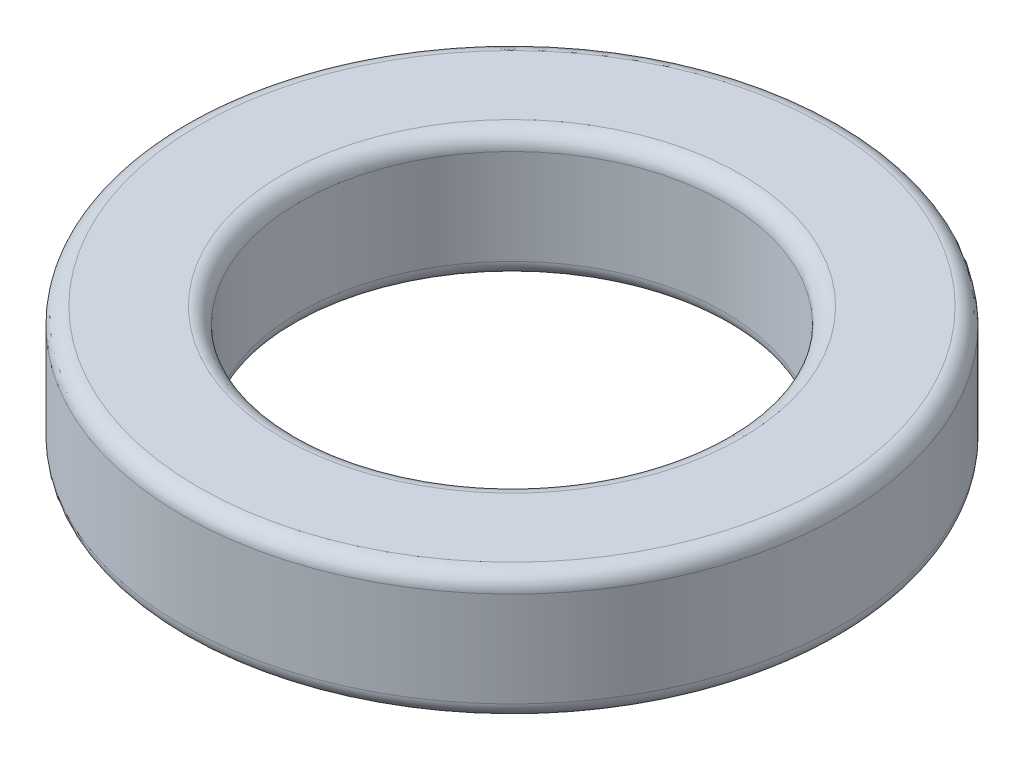
ISO-10303-21;
HEADER;
FILE_DESCRIPTION(('STEP AP214'),'2;1');
FILE_NAME('part.step','',(''),(''),'','','');
FILE_SCHEMA(('AUTOMOTIVE_DESIGN { 1 0 10303 214 1 1 1 1 }'));
ENDSEC;
DATA;
#1=APPLICATION_CONTEXT('core data for automotive mechanical design processes');
#2=APPLICATION_PROTOCOL_DEFINITION('international standard','automotive_design',2000,#1);
#3=PRODUCT_CONTEXT('',#1,'mechanical');
#4=PRODUCT('Part','Part','',(#3));
#5=PRODUCT_RELATED_PRODUCT_CATEGORY('part','',(#4));
#6=PRODUCT_DEFINITION_FORMATION('','',#4);
#7=PRODUCT_DEFINITION_CONTEXT('part definition',#1,'design');
#8=PRODUCT_DEFINITION('design','',#6,#7);
#9=PRODUCT_DEFINITION_SHAPE('','',#8);
#10=(LENGTH_UNIT() NAMED_UNIT(*) SI_UNIT(.MILLI.,.METRE.));
#11=(NAMED_UNIT(*) PLANE_ANGLE_UNIT() SI_UNIT($,.RADIAN.));
#12=(NAMED_UNIT(*) SI_UNIT($,.STERADIAN.) SOLID_ANGLE_UNIT());
#13=UNCERTAINTY_MEASURE_WITH_UNIT(LENGTH_MEASURE(1.E-05),#10,'distance_accuracy_value','');
#14=(GEOMETRIC_REPRESENTATION_CONTEXT(3) GLOBAL_UNCERTAINTY_ASSIGNED_CONTEXT((#13)) GLOBAL_UNIT_ASSIGNED_CONTEXT((#10,
#11,#12)) REPRESENTATION_CONTEXT('',''));
#15=CARTESIAN_POINT('',(0.,0.,0.));
#16=DIRECTION('',(0.,0.,1.));
#17=DIRECTION('',(1.,0.,0.));
#18=AXIS2_PLACEMENT_3D('',#15,#16,#17);
#19=CARTESIAN_POINT('',(0.,6.,0.));
#20=DIRECTION('',(0.,1.,0.));
#21=DIRECTION('',(0.,0.,1.));
#22=AXIS2_PLACEMENT_3D('',#19,#20,#21);
#23=PLANE('',#22);
#24=CARTESIAN_POINT('',(0.,6.,0.));
#25=DIRECTION('',(0.,1.,0.));
#26=DIRECTION('',(0.,0.,1.));
#27=AXIS2_PLACEMENT_3D('',#24,#25,#26);
#28=CIRCLE('',#27,21.524);
#29=CARTESIAN_POINT('',(0.,6.,21.524));
#30=VERTEX_POINT('',#29);
#31=EDGE_CURVE('E10',#30,#30,#28,.F.);
#32=ORIENTED_EDGE('',*,*,#31,.T.);
#33=EDGE_LOOP('',(#32));
#34=FACE_BOUND('',#33,.T.);
#35=CARTESIAN_POINT('',(0.,6.,0.));
#36=DIRECTION('',(0.,1.,0.));
#37=DIRECTION('',(0.,0.,1.));
#38=AXIS2_PLACEMENT_3D('',#35,#36,#37);
#39=CIRCLE('',#38,29.476);
#40=CARTESIAN_POINT('',(0.,6.,29.476));
#41=VERTEX_POINT('',#40);
#42=EDGE_CURVE('E42',#41,#41,#39,.T.);
#43=ORIENTED_EDGE('',*,*,#42,.T.);
#44=EDGE_LOOP('',(#43));
#45=FACE_BOUND('',#44,.T.);
#46=ADVANCED_FACE('F35',(#34,#45),#23,.T.);
#47=CARTESIAN_POINT('',(0.,-6.,0.));
#48=DIRECTION('',(0.,1.,0.));
#49=DIRECTION('',(0.,0.,1.));
#50=AXIS2_PLACEMENT_3D('',#47,#48,#49);
#51=PLANE('',#50);
#52=CARTESIAN_POINT('',(0.,-6.,0.));
#53=DIRECTION('',(0.,1.,0.));
#54=DIRECTION('',(0.,0.,1.));
#55=AXIS2_PLACEMENT_3D('',#52,#53,#54);
#56=CIRCLE('',#55,29.476);
#57=CARTESIAN_POINT('',(0.,-6.,29.476));
#58=VERTEX_POINT('',#57);
#59=EDGE_CURVE('E55',#58,#58,#56,.F.);
#60=ORIENTED_EDGE('',*,*,#59,.T.);
#61=EDGE_LOOP('',(#60));
#62=FACE_BOUND('',#61,.T.);
#63=CARTESIAN_POINT('',(0.,-6.,0.));
#64=DIRECTION('',(0.,1.,0.));
#65=DIRECTION('',(0.,0.,1.));
#66=AXIS2_PLACEMENT_3D('',#63,#64,#65);
#67=CIRCLE('',#66,21.524);
#68=CARTESIAN_POINT('',(0.,-6.,21.524));
#69=VERTEX_POINT('',#68);
#70=EDGE_CURVE('E58',#69,#69,#67,.T.);
#71=ORIENTED_EDGE('',*,*,#70,.T.);
#72=EDGE_LOOP('',(#71));
#73=FACE_BOUND('',#72,.T.);
#74=ADVANCED_FACE('F79',(#62,#73),#51,.F.);
#75=CARTESIAN_POINT('',(0.,6.,0.));
#76=DIRECTION('',(0.,-1.,0.));
#77=DIRECTION('',(0.,0.,-1.));
#78=AXIS2_PLACEMENT_3D('',#75,#76,#77);
#79=CYLINDRICAL_SURFACE('',#78,31.);
#80=CARTESIAN_POINT('',(0.,-4.476,0.));
#81=DIRECTION('',(0.,1.,0.));
#82=DIRECTION('',(0.,0.,1.));
#83=AXIS2_PLACEMENT_3D('',#80,#81,#82);
#84=CIRCLE('',#83,31.);
#85=CARTESIAN_POINT('',(0.,-4.476,31.));
#86=VERTEX_POINT('',#85);
#87=EDGE_CURVE('E61',#86,#86,#84,.T.);
#88=ORIENTED_EDGE('',*,*,#87,.T.);
#89=EDGE_LOOP('',(#88));
#90=FACE_BOUND('',#89,.T.);
#91=CARTESIAN_POINT('',(0.,4.476,0.));
#92=DIRECTION('',(0.,1.,0.));
#93=DIRECTION('',(0.,0.,1.));
#94=AXIS2_PLACEMENT_3D('',#91,#92,#93);
#95=CIRCLE('',#94,31.);
#96=CARTESIAN_POINT('',(0.,4.476,31.));
#97=VERTEX_POINT('',#96);
#98=EDGE_CURVE('E64',#97,#97,#95,.F.);
#99=ORIENTED_EDGE('',*,*,#98,.T.);
#100=EDGE_LOOP('',(#99));
#101=FACE_BOUND('',#100,.T.);
#102=ADVANCED_FACE('F68',(#90,#101),#79,.T.);
#103=CARTESIAN_POINT('',(0.,6.,0.));
#104=DIRECTION('',(0.,-1.,0.));
#105=DIRECTION('',(0.,0.,-1.));
#106=AXIS2_PLACEMENT_3D('',#103,#104,#105);
#107=CYLINDRICAL_SURFACE('',#106,20.);
#108=CARTESIAN_POINT('',(0.,-4.476,0.));
#109=DIRECTION('',(0.,1.,0.));
#110=DIRECTION('',(0.,0.,1.));
#111=AXIS2_PLACEMENT_3D('',#108,#109,#110);
#112=CIRCLE('',#111,20.);
#113=CARTESIAN_POINT('',(0.,-4.476,20.));
#114=VERTEX_POINT('',#113);
#115=EDGE_CURVE('E46',#114,#114,#112,.F.);
#116=ORIENTED_EDGE('',*,*,#115,.T.);
#117=EDGE_LOOP('',(#116));
#118=FACE_BOUND('',#117,.T.);
#119=CARTESIAN_POINT('',(0.,4.476,0.));
#120=DIRECTION('',(0.,1.,0.));
#121=DIRECTION('',(0.,0.,1.));
#122=AXIS2_PLACEMENT_3D('',#119,#120,#121);
#123=CIRCLE('',#122,20.);
#124=CARTESIAN_POINT('',(0.,4.476,20.));
#125=VERTEX_POINT('',#124);
#126=EDGE_CURVE('E50',#125,#125,#123,.T.);
#127=ORIENTED_EDGE('',*,*,#126,.T.);
#128=EDGE_LOOP('',(#127));
#129=FACE_BOUND('',#128,.T.);
#130=ADVANCED_FACE('F87',(#118,#129),#107,.F.);
#131=CARTESIAN_POINT('',(0.,-4.476,0.));
#132=DIRECTION('',(0.,1.,0.));
#133=DIRECTION('',(0.,0.,1.));
#134=AXIS2_PLACEMENT_3D('',#131,#132,#133);
#135=TOROIDAL_SURFACE('',#134,29.476,1.524);
#136=ORIENTED_EDGE('',*,*,#59,.F.);
#137=EDGE_LOOP('',(#136));
#138=FACE_BOUND('',#137,.T.);
#139=ORIENTED_EDGE('',*,*,#87,.F.);
#140=EDGE_LOOP('',(#139));
#141=FACE_BOUND('',#140,.T.);
#142=ADVANCED_FACE('F92',(#138,#141),#135,.T.);
#143=CARTESIAN_POINT('',(0.,-4.476,0.));
#144=DIRECTION('',(0.,1.,0.));
#145=DIRECTION('',(0.,0.,1.));
#146=AXIS2_PLACEMENT_3D('',#143,#144,#145);
#147=TOROIDAL_SURFACE('',#146,21.524,1.524);
#148=ORIENTED_EDGE('',*,*,#115,.F.);
#149=EDGE_LOOP('',(#148));
#150=FACE_BOUND('',#149,.T.);
#151=ORIENTED_EDGE('',*,*,#70,.F.);
#152=EDGE_LOOP('',(#151));
#153=FACE_BOUND('',#152,.T.);
#154=ADVANCED_FACE('F76',(#150,#153),#147,.T.);
#155=CARTESIAN_POINT('',(0.,4.476,0.));
#156=DIRECTION('',(0.,1.,0.));
#157=DIRECTION('',(0.,0.,1.));
#158=AXIS2_PLACEMENT_3D('',#155,#156,#157);
#159=TOROIDAL_SURFACE('',#158,21.524,1.524);
#160=ORIENTED_EDGE('',*,*,#31,.F.);
#161=EDGE_LOOP('',(#160));
#162=FACE_BOUND('',#161,.T.);
#163=ORIENTED_EDGE('',*,*,#126,.F.);
#164=EDGE_LOOP('',(#163));
#165=FACE_BOUND('',#164,.T.);
#166=ADVANCED_FACE('F72',(#162,#165),#159,.T.);
#167=CARTESIAN_POINT('',(0.,4.476,0.));
#168=DIRECTION('',(0.,1.,0.));
#169=DIRECTION('',(0.,0.,1.));
#170=AXIS2_PLACEMENT_3D('',#167,#168,#169);
#171=TOROIDAL_SURFACE('',#170,29.476,1.524);
#172=ORIENTED_EDGE('',*,*,#98,.F.);
#173=EDGE_LOOP('',(#172));
#174=FACE_BOUND('',#173,.T.);
#175=ORIENTED_EDGE('',*,*,#42,.F.);
#176=EDGE_LOOP('',(#175));
#177=FACE_BOUND('',#176,.T.);
#178=ADVANCED_FACE('F37',(#174,#177),#171,.T.);
#179=CLOSED_SHELL('',(#46,#74,#102,#130,#142,#154,#166,#178));
#180=MANIFOLD_SOLID_BREP('B2',#179);
#181=ADVANCED_BREP_SHAPE_REPRESENTATION('',(#18,#180),#14);
#182=SHAPE_DEFINITION_REPRESENTATION(#9,#181);
ENDSEC;
END-ISO-10303-21;
